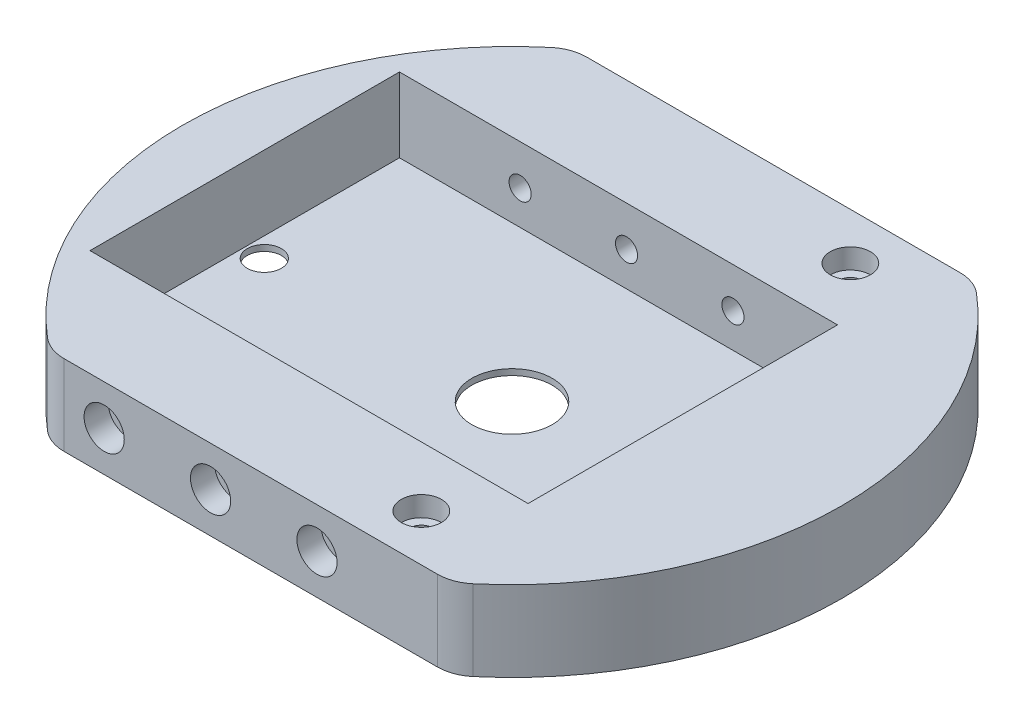
ISO-10303-21;
HEADER;
FILE_DESCRIPTION(('STEP AP214'),'2;1');
FILE_NAME('part.step','',(''),(''),'','','');
FILE_SCHEMA(('AUTOMOTIVE_DESIGN { 1 0 10303 214 1 1 1 1 }'));
ENDSEC;
DATA;
#1=APPLICATION_CONTEXT('core data for automotive mechanical design processes');
#2=APPLICATION_PROTOCOL_DEFINITION('international standard','automotive_design',2000,#1);
#3=PRODUCT_CONTEXT('',#1,'mechanical');
#4=PRODUCT('Part','Part','',(#3));
#5=PRODUCT_RELATED_PRODUCT_CATEGORY('part','',(#4));
#6=PRODUCT_DEFINITION_FORMATION('','',#4);
#7=PRODUCT_DEFINITION_CONTEXT('part definition',#1,'design');
#8=PRODUCT_DEFINITION('design','',#6,#7);
#9=PRODUCT_DEFINITION_SHAPE('','',#8);
#10=(LENGTH_UNIT() NAMED_UNIT(*) SI_UNIT(.MILLI.,.METRE.));
#11=(NAMED_UNIT(*) PLANE_ANGLE_UNIT() SI_UNIT($,.RADIAN.));
#12=(NAMED_UNIT(*) SI_UNIT($,.STERADIAN.) SOLID_ANGLE_UNIT());
#13=UNCERTAINTY_MEASURE_WITH_UNIT(LENGTH_MEASURE(1.E-05),#10,'distance_accuracy_value','');
#14=(GEOMETRIC_REPRESENTATION_CONTEXT(3) GLOBAL_UNCERTAINTY_ASSIGNED_CONTEXT((#13)) GLOBAL_UNIT_ASSIGNED_CONTEXT((#10,
#11,#12)) REPRESENTATION_CONTEXT('',''));
#15=CARTESIAN_POINT('',(0.,0.,0.));
#16=DIRECTION('',(0.,0.,1.));
#17=DIRECTION('',(1.,0.,0.));
#18=AXIS2_PLACEMENT_3D('',#15,#16,#17);
#19=CARTESIAN_POINT('',(30.8149999999999,30.,53.373145635235));
#20=DIRECTION('',(0.,-1.,0.));
#21=DIRECTION('',(0.,0.,-1.));
#22=AXIS2_PLACEMENT_3D('',#19,#20,#21);
#23=CYLINDRICAL_SURFACE('',#22,2.75);
#24=CARTESIAN_POINT('',(30.8149999999999,10.,53.373145635235));
#25=DIRECTION('',(0.,-1.,0.));
#26=DIRECTION('',(0.,0.,-1.));
#27=AXIS2_PLACEMENT_3D('',#24,#25,#26);
#28=CIRCLE('',#27,2.75);
#29=CARTESIAN_POINT('',(30.8149999999999,10.,50.623145635235));
#30=VERTEX_POINT('',#29);
#31=EDGE_CURVE('E280',#30,#30,#28,.T.);
#32=ORIENTED_EDGE('',*,*,#31,.T.);
#33=EDGE_LOOP('',(#32));
#34=FACE_BOUND('',#33,.T.);
#35=CARTESIAN_POINT('',(30.8149999999999,15.,53.373145635235));
#36=DIRECTION('',(0.,1.,0.));
#37=DIRECTION('',(0.,0.,1.));
#38=AXIS2_PLACEMENT_3D('',#35,#36,#37);
#39=CIRCLE('',#38,2.75);
#40=CARTESIAN_POINT('',(30.8149999999999,15.,56.123145635235));
#41=VERTEX_POINT('',#40);
#42=EDGE_CURVE('E37',#41,#41,#39,.F.);
#43=ORIENTED_EDGE('',*,*,#42,.F.);
#44=EDGE_LOOP('',(#43));
#45=FACE_BOUND('',#44,.T.);
#46=ADVANCED_FACE('F33',(#34,#45),#23,.F.);
#47=CARTESIAN_POINT('',(30.8149999999999,30.,-53.373145635235));
#48=DIRECTION('',(0.,-1.,0.));
#49=DIRECTION('',(0.,0.,-1.));
#50=AXIS2_PLACEMENT_3D('',#47,#48,#49);
#51=CYLINDRICAL_SURFACE('',#50,2.75);
#52=CARTESIAN_POINT('',(30.8149999999999,10.,-53.373145635235));
#53=DIRECTION('',(0.,-1.,0.));
#54=DIRECTION('',(0.,0.,-1.));
#55=AXIS2_PLACEMENT_3D('',#52,#53,#54);
#56=CIRCLE('',#55,2.75);
#57=CARTESIAN_POINT('',(30.8149999999999,10.,-56.123145635235));
#58=VERTEX_POINT('',#57);
#59=EDGE_CURVE('E275',#58,#58,#56,.T.);
#60=ORIENTED_EDGE('',*,*,#59,.T.);
#61=EDGE_LOOP('',(#60));
#62=FACE_BOUND('',#61,.T.);
#63=CARTESIAN_POINT('',(30.8149999999999,15.,-53.373145635235));
#64=DIRECTION('',(0.,1.,0.));
#65=DIRECTION('',(0.,0.,1.));
#66=AXIS2_PLACEMENT_3D('',#63,#64,#65);
#67=CIRCLE('',#66,2.75);
#68=CARTESIAN_POINT('',(30.8149999999999,15.,-50.623145635235));
#69=VERTEX_POINT('',#68);
#70=EDGE_CURVE('E273',#69,#69,#67,.F.);
#71=ORIENTED_EDGE('',*,*,#70,.F.);
#72=EDGE_LOOP('',(#71));
#73=FACE_BOUND('',#72,.T.);
#74=ADVANCED_FACE('F386',(#62,#73),#51,.F.);
#75=CARTESIAN_POINT('',(-36.4744881985195,9.99999999999999,-35.));
#76=DIRECTION('',(0.,0.,-1.));
#77=DIRECTION('',(-1.,0.,0.));
#78=AXIS2_PLACEMENT_3D('',#75,#76,#77);
#79=CYLINDRICAL_SURFACE('',#78,2.75);
#80=CARTESIAN_POINT('',(-36.4744881985195,9.99999999999999,-38.5));
#81=DIRECTION('',(0.,0.,-1.));
#82=DIRECTION('',(-1.,0.,0.));
#83=AXIS2_PLACEMENT_3D('',#80,#81,#82);
#84=CIRCLE('',#83,2.75);
#85=CARTESIAN_POINT('',(-39.2244881985195,9.99999999999999,-38.5));
#86=VERTEX_POINT('',#85);
#87=EDGE_CURVE('E242',#86,#86,#84,.T.);
#88=ORIENTED_EDGE('',*,*,#87,.F.);
#89=EDGE_LOOP('',(#88));
#90=FACE_BOUND('',#89,.T.);
#91=CARTESIAN_POINT('',(-36.4744881985195,9.99999999999999,-59.));
#92=DIRECTION('',(0.,0.,-1.));
#93=DIRECTION('',(-1.,0.,0.));
#94=AXIS2_PLACEMENT_3D('',#91,#92,#93);
#95=CIRCLE('',#94,2.75);
#96=CARTESIAN_POINT('',(-39.2244881985195,9.99999999999999,-59.));
#97=VERTEX_POINT('',#96);
#98=EDGE_CURVE('E269',#97,#97,#95,.F.);
#99=ORIENTED_EDGE('',*,*,#98,.F.);
#100=EDGE_LOOP('',(#99));
#101=FACE_BOUND('',#100,.T.);
#102=ADVANCED_FACE('F393',(#90,#101),#79,.F.);
#103=CARTESIAN_POINT('',(-10.0005118014805,10.,-35.));
#104=DIRECTION('',(0.,0.,-1.));
#105=DIRECTION('',(-1.,0.,0.));
#106=AXIS2_PLACEMENT_3D('',#103,#104,#105);
#107=CYLINDRICAL_SURFACE('',#106,2.75);
#108=CARTESIAN_POINT('',(-10.0005118014805,10.,-38.5));
#109=DIRECTION('',(0.,0.,-1.));
#110=DIRECTION('',(-1.,0.,0.));
#111=AXIS2_PLACEMENT_3D('',#108,#109,#110);
#112=CIRCLE('',#111,2.75);
#113=CARTESIAN_POINT('',(-12.7505118014805,10.,-38.5));
#114=VERTEX_POINT('',#113);
#115=EDGE_CURVE('E239',#114,#114,#112,.T.);
#116=ORIENTED_EDGE('',*,*,#115,.F.);
#117=EDGE_LOOP('',(#116));
#118=FACE_BOUND('',#117,.T.);
#119=CARTESIAN_POINT('',(-10.0005118014805,10.,-59.));
#120=DIRECTION('',(0.,0.,-1.));
#121=DIRECTION('',(-1.,0.,0.));
#122=AXIS2_PLACEMENT_3D('',#119,#120,#121);
#123=CIRCLE('',#122,2.75);
#124=CARTESIAN_POINT('',(-12.7505118014805,10.,-59.));
#125=VERTEX_POINT('',#124);
#126=EDGE_CURVE('E264',#125,#125,#123,.F.);
#127=ORIENTED_EDGE('',*,*,#126,.F.);
#128=EDGE_LOOP('',(#127));
#129=FACE_BOUND('',#128,.T.);
#130=ADVANCED_FACE('F450',(#118,#129),#107,.F.);
#131=CARTESIAN_POINT('',(16.4744881985195,9.99999999999999,-35.));
#132=DIRECTION('',(0.,0.,-1.));
#133=DIRECTION('',(-1.,0.,0.));
#134=AXIS2_PLACEMENT_3D('',#131,#132,#133);
#135=CYLINDRICAL_SURFACE('',#134,2.75);
#136=CARTESIAN_POINT('',(16.4744881985195,9.99999999999999,-38.5));
#137=DIRECTION('',(0.,0.,-1.));
#138=DIRECTION('',(-1.,0.,0.));
#139=AXIS2_PLACEMENT_3D('',#136,#137,#138);
#140=CIRCLE('',#139,2.75);
#141=CARTESIAN_POINT('',(13.7244881985195,9.99999999999999,-38.5));
#142=VERTEX_POINT('',#141);
#143=EDGE_CURVE('E236',#142,#142,#140,.T.);
#144=ORIENTED_EDGE('',*,*,#143,.F.);
#145=EDGE_LOOP('',(#144));
#146=FACE_BOUND('',#145,.T.);
#147=CARTESIAN_POINT('',(16.4744881985195,9.99999999999999,-59.));
#148=DIRECTION('',(0.,0.,-1.));
#149=DIRECTION('',(-1.,0.,0.));
#150=AXIS2_PLACEMENT_3D('',#147,#148,#149);
#151=CIRCLE('',#150,2.75);
#152=CARTESIAN_POINT('',(13.7244881985195,9.99999999999999,-59.));
#153=VERTEX_POINT('',#152);
#154=EDGE_CURVE('E259',#153,#153,#151,.F.);
#155=ORIENTED_EDGE('',*,*,#154,.F.);
#156=EDGE_LOOP('',(#155));
#157=FACE_BOUND('',#156,.T.);
#158=ADVANCED_FACE('F454',(#146,#157),#135,.F.);
#159=CARTESIAN_POINT('',(16.4744881985195,10.,35.));
#160=DIRECTION('',(0.,0.,1.));
#161=DIRECTION('',(1.,0.,0.));
#162=AXIS2_PLACEMENT_3D('',#159,#160,#161);
#163=CYLINDRICAL_SURFACE('',#162,2.75);
#164=CARTESIAN_POINT('',(16.4744881985195,10.,38.5));
#165=DIRECTION('',(0.,0.,1.));
#166=DIRECTION('',(1.,0.,0.));
#167=AXIS2_PLACEMENT_3D('',#164,#165,#166);
#168=CIRCLE('',#167,2.75);
#169=CARTESIAN_POINT('',(19.2244881985195,10.,38.5));
#170=VERTEX_POINT('',#169);
#171=EDGE_CURVE('E233',#170,#170,#168,.T.);
#172=ORIENTED_EDGE('',*,*,#171,.F.);
#173=EDGE_LOOP('',(#172));
#174=FACE_BOUND('',#173,.T.);
#175=CARTESIAN_POINT('',(16.4744881985195,10.,59.));
#176=DIRECTION('',(0.,0.,1.));
#177=DIRECTION('',(1.,0.,0.));
#178=AXIS2_PLACEMENT_3D('',#175,#176,#177);
#179=CIRCLE('',#178,2.75);
#180=CARTESIAN_POINT('',(19.2244881985195,10.,59.));
#181=VERTEX_POINT('',#180);
#182=EDGE_CURVE('E254',#181,#181,#179,.F.);
#183=ORIENTED_EDGE('',*,*,#182,.F.);
#184=EDGE_LOOP('',(#183));
#185=FACE_BOUND('',#184,.T.);
#186=ADVANCED_FACE('F458',(#174,#185),#163,.F.);
#187=CARTESIAN_POINT('',(-10.0005118014805,10.,35.));
#188=DIRECTION('',(0.,0.,1.));
#189=DIRECTION('',(1.,0.,0.));
#190=AXIS2_PLACEMENT_3D('',#187,#188,#189);
#191=CYLINDRICAL_SURFACE('',#190,2.75);
#192=CARTESIAN_POINT('',(-10.0005118014805,10.,38.5));
#193=DIRECTION('',(0.,0.,1.));
#194=DIRECTION('',(1.,0.,0.));
#195=AXIS2_PLACEMENT_3D('',#192,#193,#194);
#196=CIRCLE('',#195,2.75);
#197=CARTESIAN_POINT('',(-7.2505118014805,10.,38.5));
#198=VERTEX_POINT('',#197);
#199=EDGE_CURVE('E230',#198,#198,#196,.T.);
#200=ORIENTED_EDGE('',*,*,#199,.F.);
#201=EDGE_LOOP('',(#200));
#202=FACE_BOUND('',#201,.T.);
#203=CARTESIAN_POINT('',(-10.0005118014805,10.,59.));
#204=DIRECTION('',(0.,0.,1.));
#205=DIRECTION('',(1.,0.,0.));
#206=AXIS2_PLACEMENT_3D('',#203,#204,#205);
#207=CIRCLE('',#206,2.75);
#208=CARTESIAN_POINT('',(-7.2505118014805,10.,59.));
#209=VERTEX_POINT('',#208);
#210=EDGE_CURVE('E249',#209,#209,#207,.F.);
#211=ORIENTED_EDGE('',*,*,#210,.F.);
#212=EDGE_LOOP('',(#211));
#213=FACE_BOUND('',#212,.T.);
#214=ADVANCED_FACE('F462',(#202,#213),#191,.F.);
#215=CARTESIAN_POINT('',(-36.4744881985195,10.,35.));
#216=DIRECTION('',(0.,0.,1.));
#217=DIRECTION('',(1.,0.,0.));
#218=AXIS2_PLACEMENT_3D('',#215,#216,#217);
#219=CYLINDRICAL_SURFACE('',#218,2.75);
#220=CARTESIAN_POINT('',(-36.4744881985195,10.,38.5));
#221=DIRECTION('',(0.,0.,1.));
#222=DIRECTION('',(1.,0.,0.));
#223=AXIS2_PLACEMENT_3D('',#220,#221,#222);
#224=CIRCLE('',#223,2.75);
#225=CARTESIAN_POINT('',(-33.7244881985195,10.,38.5));
#226=VERTEX_POINT('',#225);
#227=EDGE_CURVE('E226',#226,#226,#224,.T.);
#228=ORIENTED_EDGE('',*,*,#227,.F.);
#229=EDGE_LOOP('',(#228));
#230=FACE_BOUND('',#229,.T.);
#231=CARTESIAN_POINT('',(-36.4744881985195,10.,59.));
#232=DIRECTION('',(0.,0.,1.));
#233=DIRECTION('',(1.,0.,0.));
#234=AXIS2_PLACEMENT_3D('',#231,#232,#233);
#235=CIRCLE('',#234,2.75);
#236=CARTESIAN_POINT('',(-33.7244881985195,10.,59.));
#237=VERTEX_POINT('',#236);
#238=EDGE_CURVE('E245',#237,#237,#235,.F.);
#239=ORIENTED_EDGE('',*,*,#238,.F.);
#240=EDGE_LOOP('',(#239));
#241=FACE_BOUND('',#240,.T.);
#242=ADVANCED_FACE('F466',(#230,#241),#219,.F.);
#243=CARTESIAN_POINT('',(0.,20.,0.));
#244=DIRECTION('',(0.,-1.,0.));
#245=DIRECTION('',(0.,0.,-1.));
#246=AXIS2_PLACEMENT_3D('',#243,#244,#245);
#247=CYLINDRICAL_SURFACE('',#246,82.0060973342836);
#248=CARTESIAN_POINT('',(0.,20.,0.));
#249=DIRECTION('',(0.,1.,0.));
#250=DIRECTION('',(0.,0.,1.));
#251=AXIS2_PLACEMENT_3D('',#248,#249,#250);
#252=CIRCLE('',#251,82.0060973342836);
#253=CARTESIAN_POINT('',(-52.9287316472048,20.,-62.6382420428462));
#254=VERTEX_POINT('',#253);
#255=CARTESIAN_POINT('',(-52.9287316472048,20.,62.6382420428462));
#256=VERTEX_POINT('',#255);
#257=EDGE_CURVE('E168',#254,#256,#252,.T.);
#258=ORIENTED_EDGE('',*,*,#257,.F.);
#259=DIRECTION('',(0.,-1.,0.));
#260=VECTOR('',#259,1.);
#261=CARTESIAN_POINT('',(-52.9287316472048,20.,-62.6382420428462));
#262=LINE('',#261,#260);
#263=CARTESIAN_POINT('',(-52.9287316472048,0.,-62.6382420428462));
#264=VERTEX_POINT('',#263);
#265=EDGE_CURVE('E191',#254,#264,#262,.T.);
#266=ORIENTED_EDGE('',*,*,#265,.T.);
#267=CARTESIAN_POINT('',(0.,0.,0.));
#268=DIRECTION('',(0.,1.,0.));
#269=DIRECTION('',(0.,0.,1.));
#270=AXIS2_PLACEMENT_3D('',#267,#268,#269);
#271=CIRCLE('',#270,82.0060973342836);
#272=CARTESIAN_POINT('',(-52.9287316472048,0.,62.6382420428462));
#273=VERTEX_POINT('',#272);
#274=EDGE_CURVE('E164',#264,#273,#271,.T.);
#275=ORIENTED_EDGE('',*,*,#274,.T.);
#276=DIRECTION('',(0.,-1.,0.));
#277=VECTOR('',#276,1.);
#278=CARTESIAN_POINT('',(-52.9287316472048,20.,62.6382420428462));
#279=LINE('',#278,#277);
#280=EDGE_CURVE('E180',#273,#256,#279,.F.);
#281=ORIENTED_EDGE('',*,*,#280,.T.);
#282=EDGE_LOOP('',(#258,#266,#275,#281));
#283=FACE_BOUND('',#282,.T.);
#284=ADVANCED_FACE('F352',(#283),#247,.T.);
#285=CARTESIAN_POINT('',(-50.,20.,65.));
#286=DIRECTION('',(0.,0.,-1.));
#287=DIRECTION('',(-1.,0.,0.));
#288=AXIS2_PLACEMENT_3D('',#285,#286,#287);
#289=PLANE('',#288);
#290=CARTESIAN_POINT('',(16.4744881985195,10.,65.));
#291=DIRECTION('',(0.,0.,1.));
#292=DIRECTION('',(1.,0.,0.));
#293=AXIS2_PLACEMENT_3D('',#290,#291,#292);
#294=CIRCLE('',#293,5.);
#295=CARTESIAN_POINT('',(21.4744881985195,10.,65.));
#296=VERTEX_POINT('',#295);
#297=EDGE_CURVE('E262',#296,#296,#294,.T.);
#298=ORIENTED_EDGE('',*,*,#297,.F.);
#299=EDGE_LOOP('',(#298));
#300=FACE_BOUND('',#299,.T.);
#301=CARTESIAN_POINT('',(-10.0005118014805,10.,65.));
#302=DIRECTION('',(0.,0.,1.));
#303=DIRECTION('',(1.,0.,0.));
#304=AXIS2_PLACEMENT_3D('',#301,#302,#303);
#305=CIRCLE('',#304,5.);
#306=CARTESIAN_POINT('',(-5.0005118014805,10.,65.));
#307=VERTEX_POINT('',#306);
#308=EDGE_CURVE('E257',#307,#307,#305,.T.);
#309=ORIENTED_EDGE('',*,*,#308,.F.);
#310=EDGE_LOOP('',(#309));
#311=FACE_BOUND('',#310,.T.);
#312=CARTESIAN_POINT('',(-36.4744881985195,10.,65.));
#313=DIRECTION('',(0.,0.,1.));
#314=DIRECTION('',(1.,0.,0.));
#315=AXIS2_PLACEMENT_3D('',#312,#313,#314);
#316=CIRCLE('',#315,5.);
#317=CARTESIAN_POINT('',(-31.4744881985195,10.,65.));
#318=VERTEX_POINT('',#317);
#319=EDGE_CURVE('E252',#318,#318,#316,.T.);
#320=ORIENTED_EDGE('',*,*,#319,.F.);
#321=EDGE_LOOP('',(#320));
#322=FACE_BOUND('',#321,.T.);
#323=DIRECTION('',(1.,0.,0.));
#324=VECTOR('',#323,1.);
#325=CARTESIAN_POINT('',(-50.,0.,65.));
#326=LINE('',#325,#324);
#327=CARTESIAN_POINT('',(-46.4744881985195,0.,65.));
#328=VERTEX_POINT('',#327);
#329=CARTESIAN_POINT('',(46.4744881985195,0.,65.));
#330=VERTEX_POINT('',#329);
#331=EDGE_CURVE('E183',#328,#330,#326,.T.);
#332=ORIENTED_EDGE('',*,*,#331,.T.);
#333=DIRECTION('',(0.,-1.,0.));
#334=VECTOR('',#333,1.);
#335=CARTESIAN_POINT('',(46.4744881985195,20.,65.));
#336=LINE('',#335,#334);
#337=CARTESIAN_POINT('',(46.4744881985195,20.,65.));
#338=VERTEX_POINT('',#337);
#339=EDGE_CURVE('E11',#330,#338,#336,.F.);
#340=ORIENTED_EDGE('',*,*,#339,.T.);
#341=DIRECTION('',(1.,0.,0.));
#342=VECTOR('',#341,1.);
#343=CARTESIAN_POINT('',(-50.,20.,65.));
#344=LINE('',#343,#342);
#345=CARTESIAN_POINT('',(-46.4744881985195,20.,65.));
#346=VERTEX_POINT('',#345);
#347=EDGE_CURVE('E171',#346,#338,#344,.T.);
#348=ORIENTED_EDGE('',*,*,#347,.F.);
#349=DIRECTION('',(0.,-1.,0.));
#350=VECTOR('',#349,1.);
#351=CARTESIAN_POINT('',(-46.4744881985195,20.,65.));
#352=LINE('',#351,#350);
#353=EDGE_CURVE('E42',#346,#328,#352,.T.);
#354=ORIENTED_EDGE('',*,*,#353,.T.);
#355=EDGE_LOOP('',(#332,#340,#348,#354));
#356=FACE_BOUND('',#355,.T.);
#357=ADVANCED_FACE('F361',(#300,#311,#322,#356),#289,.F.);
#358=CARTESIAN_POINT('',(0.,20.,0.));
#359=DIRECTION('',(0.,-1.,0.));
#360=DIRECTION('',(0.,0.,-1.));
#361=AXIS2_PLACEMENT_3D('',#358,#359,#360);
#362=CYLINDRICAL_SURFACE('',#361,82.0060973342836);
#363=CARTESIAN_POINT('',(0.,0.,0.));
#364=DIRECTION('',(0.,1.,0.));
#365=DIRECTION('',(0.,0.,-1.));
#366=AXIS2_PLACEMENT_3D('',#363,#364,#365);
#367=CIRCLE('',#366,82.0060973342836);
#368=CARTESIAN_POINT('',(52.9287316472048,0.,62.6382420428462));
#369=VERTEX_POINT('',#368);
#370=CARTESIAN_POINT('',(52.9287316472048,0.,-62.6382420428462));
#371=VERTEX_POINT('',#370);
#372=EDGE_CURVE('E186',#369,#371,#367,.T.);
#373=ORIENTED_EDGE('',*,*,#372,.T.);
#374=DIRECTION('',(0.,-1.,0.));
#375=VECTOR('',#374,1.);
#376=CARTESIAN_POINT('',(52.9287316472048,20.,-62.6382420428462));
#377=LINE('',#376,#375);
#378=CARTESIAN_POINT('',(52.9287316472048,20.,-62.6382420428462));
#379=VERTEX_POINT('',#378);
#380=EDGE_CURVE('E58',#371,#379,#377,.F.);
#381=ORIENTED_EDGE('',*,*,#380,.T.);
#382=CARTESIAN_POINT('',(0.,20.,0.));
#383=DIRECTION('',(0.,1.,0.));
#384=DIRECTION('',(0.,0.,-1.));
#385=AXIS2_PLACEMENT_3D('',#382,#383,#384);
#386=CIRCLE('',#385,82.0060973342836);
#387=CARTESIAN_POINT('',(52.9287316472048,20.,62.6382420428462));
#388=VERTEX_POINT('',#387);
#389=EDGE_CURVE('E175',#388,#379,#386,.T.);
#390=ORIENTED_EDGE('',*,*,#389,.F.);
#391=DIRECTION('',(0.,-1.,0.));
#392=VECTOR('',#391,1.);
#393=CARTESIAN_POINT('',(52.9287316472048,20.,62.6382420428462));
#394=LINE('',#393,#392);
#395=EDGE_CURVE('E215',#388,#369,#394,.T.);
#396=ORIENTED_EDGE('',*,*,#395,.T.);
#397=EDGE_LOOP('',(#373,#381,#390,#396));
#398=FACE_BOUND('',#397,.T.);
#399=ADVANCED_FACE('F367',(#398),#362,.T.);
#400=CARTESIAN_POINT('',(50.,20.,-65.));
#401=DIRECTION('',(0.,0.,1.));
#402=DIRECTION('',(1.,0.,0.));
#403=AXIS2_PLACEMENT_3D('',#400,#401,#402);
#404=PLANE('',#403);
#405=CARTESIAN_POINT('',(-36.4744881985195,9.99999999999999,-65.));
#406=DIRECTION('',(0.,0.,-1.));
#407=DIRECTION('',(-1.,0.,0.));
#408=AXIS2_PLACEMENT_3D('',#405,#406,#407);
#409=CIRCLE('',#408,5.);
#410=CARTESIAN_POINT('',(-41.4744881985195,9.99999999999999,-65.));
#411=VERTEX_POINT('',#410);
#412=EDGE_CURVE('E295',#411,#411,#409,.T.);
#413=ORIENTED_EDGE('',*,*,#412,.F.);
#414=EDGE_LOOP('',(#413));
#415=FACE_BOUND('',#414,.T.);
#416=CARTESIAN_POINT('',(-10.0005118014805,10.,-65.));
#417=DIRECTION('',(0.,0.,-1.));
#418=DIRECTION('',(-1.,0.,0.));
#419=AXIS2_PLACEMENT_3D('',#416,#417,#418);
#420=CIRCLE('',#419,5.);
#421=CARTESIAN_POINT('',(-15.0005118014805,10.,-65.));
#422=VERTEX_POINT('',#421);
#423=EDGE_CURVE('E271',#422,#422,#420,.T.);
#424=ORIENTED_EDGE('',*,*,#423,.F.);
#425=EDGE_LOOP('',(#424));
#426=FACE_BOUND('',#425,.T.);
#427=CARTESIAN_POINT('',(16.4744881985195,9.99999999999999,-65.));
#428=DIRECTION('',(0.,0.,-1.));
#429=DIRECTION('',(-1.,0.,0.));
#430=AXIS2_PLACEMENT_3D('',#427,#428,#429);
#431=CIRCLE('',#430,5.);
#432=CARTESIAN_POINT('',(11.4744881985195,9.99999999999999,-65.));
#433=VERTEX_POINT('',#432);
#434=EDGE_CURVE('E267',#433,#433,#431,.T.);
#435=ORIENTED_EDGE('',*,*,#434,.F.);
#436=EDGE_LOOP('',(#435));
#437=FACE_BOUND('',#436,.T.);
#438=DIRECTION('',(-1.,0.,0.));
#439=VECTOR('',#438,1.);
#440=CARTESIAN_POINT('',(50.,0.,-65.));
#441=LINE('',#440,#439);
#442=CARTESIAN_POINT('',(46.4744881985195,0.,-65.));
#443=VERTEX_POINT('',#442);
#444=CARTESIAN_POINT('',(-46.4744881985195,0.,-65.));
#445=VERTEX_POINT('',#444);
#446=EDGE_CURVE('E172',#443,#445,#441,.T.);
#447=ORIENTED_EDGE('',*,*,#446,.T.);
#448=DIRECTION('',(0.,-1.,0.));
#449=VECTOR('',#448,1.);
#450=CARTESIAN_POINT('',(-46.4744881985195,20.,-65.));
#451=LINE('',#450,#449);
#452=CARTESIAN_POINT('',(-46.4744881985195,20.,-65.));
#453=VERTEX_POINT('',#452);
#454=EDGE_CURVE('E205',#445,#453,#451,.F.);
#455=ORIENTED_EDGE('',*,*,#454,.T.);
#456=DIRECTION('',(-1.,0.,0.));
#457=VECTOR('',#456,1.);
#458=CARTESIAN_POINT('',(50.,20.,-65.));
#459=LINE('',#458,#457);
#460=CARTESIAN_POINT('',(46.4744881985195,20.,-65.));
#461=VERTEX_POINT('',#460);
#462=EDGE_CURVE('E177',#461,#453,#459,.T.);
#463=ORIENTED_EDGE('',*,*,#462,.F.);
#464=DIRECTION('',(0.,-1.,0.));
#465=VECTOR('',#464,1.);
#466=CARTESIAN_POINT('',(46.4744881985195,20.,-65.));
#467=LINE('',#466,#465);
#468=EDGE_CURVE('E202',#461,#443,#467,.T.);
#469=ORIENTED_EDGE('',*,*,#468,.T.);
#470=EDGE_LOOP('',(#447,#455,#463,#469));
#471=FACE_BOUND('',#470,.T.);
#472=ADVANCED_FACE('F374',(#415,#426,#437,#471),#404,.F.);
#473=CARTESIAN_POINT('',(0.,20.,0.));
#474=DIRECTION('',(0.,1.,0.));
#475=DIRECTION('',(0.,0.,1.));
#476=AXIS2_PLACEMENT_3D('',#473,#474,#475);
#477=PLANE('',#476);
#478=CARTESIAN_POINT('',(30.8149999999999,20.,53.373145635235));
#479=DIRECTION('',(0.,1.,0.));
#480=DIRECTION('',(0.,0.,1.));
#481=AXIS2_PLACEMENT_3D('',#478,#479,#480);
#482=CIRCLE('',#481,5.);
#483=CARTESIAN_POINT('',(30.8149999999999,20.,58.373145635235));
#484=VERTEX_POINT('',#483);
#485=EDGE_CURVE('E290',#484,#484,#482,.T.);
#486=ORIENTED_EDGE('',*,*,#485,.F.);
#487=EDGE_LOOP('',(#486));
#488=FACE_BOUND('',#487,.T.);
#489=CARTESIAN_POINT('',(30.8149999999999,20.,-53.373145635235));
#490=DIRECTION('',(0.,1.,0.));
#491=DIRECTION('',(0.,0.,1.));
#492=AXIS2_PLACEMENT_3D('',#489,#490,#491);
#493=CIRCLE('',#492,5.);
#494=CARTESIAN_POINT('',(30.8149999999999,20.,-48.373145635235));
#495=VERTEX_POINT('',#494);
#496=EDGE_CURVE('E283',#495,#495,#493,.T.);
#497=ORIENTED_EDGE('',*,*,#496,.F.);
#498=EDGE_LOOP('',(#497));
#499=FACE_BOUND('',#498,.T.);
#500=DIRECTION('',(0.,0.,-1.));
#501=VECTOR('',#500,1.);
#502=CARTESIAN_POINT('',(42.5,20.,38.5));
#503=LINE('',#502,#501);
#504=CARTESIAN_POINT('',(42.5,20.,38.5));
#505=VERTEX_POINT('',#504);
#506=CARTESIAN_POINT('',(42.5,20.,-38.5));
#507=VERTEX_POINT('',#506);
#508=EDGE_CURVE('E50',#505,#507,#503,.T.);
#509=ORIENTED_EDGE('',*,*,#508,.F.);
#510=DIRECTION('',(1.,0.,0.));
#511=VECTOR('',#510,1.);
#512=CARTESIAN_POINT('',(-66.5,20.,38.5));
#513=LINE('',#512,#511);
#514=CARTESIAN_POINT('',(-66.5,20.,38.5));
#515=VERTEX_POINT('',#514);
#516=EDGE_CURVE('E145',#515,#505,#513,.T.);
#517=ORIENTED_EDGE('',*,*,#516,.F.);
#518=DIRECTION('',(0.,0.,1.));
#519=VECTOR('',#518,1.);
#520=CARTESIAN_POINT('',(-66.5,20.,38.5));
#521=LINE('',#520,#519);
#522=CARTESIAN_POINT('',(-66.5,20.,-38.5));
#523=VERTEX_POINT('',#522);
#524=EDGE_CURVE('E148',#523,#515,#521,.T.);
#525=ORIENTED_EDGE('',*,*,#524,.F.);
#526=DIRECTION('',(-1.,0.,0.));
#527=VECTOR('',#526,1.);
#528=CARTESIAN_POINT('',(-66.5,20.,-38.5));
#529=LINE('',#528,#527);
#530=EDGE_CURVE('E157',#507,#523,#529,.T.);
#531=ORIENTED_EDGE('',*,*,#530,.F.);
#532=EDGE_LOOP('',(#509,#517,#525,#531));
#533=FACE_BOUND('',#532,.T.);
#534=ORIENTED_EDGE('',*,*,#462,.T.);
#535=CARTESIAN_POINT('',(-46.4744881985195,20.,-55.));
#536=DIRECTION('',(0.,1.,0.));
#537=DIRECTION('',(0.,0.,1.));
#538=AXIS2_PLACEMENT_3D('',#535,#536,#537);
#539=CIRCLE('',#538,10.);
#540=EDGE_CURVE('E213',#453,#254,#539,.T.);
#541=ORIENTED_EDGE('',*,*,#540,.T.);
#542=ORIENTED_EDGE('',*,*,#257,.T.);
#543=CARTESIAN_POINT('',(-46.4744881985195,20.,55.));
#544=DIRECTION('',(0.,1.,0.));
#545=DIRECTION('',(0.,0.,1.));
#546=AXIS2_PLACEMENT_3D('',#543,#544,#545);
#547=CIRCLE('',#546,10.);
#548=EDGE_CURVE('E207',#256,#346,#547,.T.);
#549=ORIENTED_EDGE('',*,*,#548,.T.);
#550=ORIENTED_EDGE('',*,*,#347,.T.);
#551=CARTESIAN_POINT('',(46.4744881985195,20.,55.));
#552=DIRECTION('',(0.,1.,0.));
#553=DIRECTION('',(0.,0.,1.));
#554=AXIS2_PLACEMENT_3D('',#551,#552,#553);
#555=CIRCLE('',#554,10.);
#556=EDGE_CURVE('E209',#338,#388,#555,.T.);
#557=ORIENTED_EDGE('',*,*,#556,.T.);
#558=ORIENTED_EDGE('',*,*,#389,.T.);
#559=CARTESIAN_POINT('',(46.4744881985195,20.,-55.));
#560=DIRECTION('',(0.,1.,0.));
#561=DIRECTION('',(0.,0.,1.));
#562=AXIS2_PLACEMENT_3D('',#559,#560,#561);
#563=CIRCLE('',#562,10.);
#564=EDGE_CURVE('E211',#379,#461,#563,.T.);
#565=ORIENTED_EDGE('',*,*,#564,.T.);
#566=EDGE_LOOP('',(#534,#541,#542,#549,#550,#557,#558,#565));
#567=FACE_BOUND('',#566,.T.);
#568=ADVANCED_FACE('F343',(#488,#499,#533,#567),#477,.T.);
#569=CARTESIAN_POINT('',(0.,0.,0.));
#570=DIRECTION('',(0.,1.,0.));
#571=DIRECTION('',(0.,0.,1.));
#572=AXIS2_PLACEMENT_3D('',#569,#570,#571);
#573=PLANE('',#572);
#574=CARTESIAN_POINT('',(0.,0.,0.));
#575=DIRECTION('',(0.,1.,0.));
#576=DIRECTION('',(0.,0.,1.));
#577=AXIS2_PLACEMENT_3D('',#574,#575,#576);
#578=CIRCLE('',#577,10.);
#579=CARTESIAN_POINT('',(0.,0.,10.));
#580=VERTEX_POINT('',#579);
#581=EDGE_CURVE('E322',#580,#580,#578,.T.);
#582=ORIENTED_EDGE('',*,*,#581,.T.);
#583=EDGE_LOOP('',(#582));
#584=FACE_BOUND('',#583,.T.);
#585=CARTESIAN_POINT('',(-61.63,0.,0.));
#586=DIRECTION('',(0.,-1.,0.));
#587=DIRECTION('',(0.,0.,-1.));
#588=AXIS2_PLACEMENT_3D('',#585,#586,#587);
#589=CIRCLE('',#588,4.25000000000001);
#590=CARTESIAN_POINT('',(-61.63,0.,-4.25000000000001));
#591=VERTEX_POINT('',#590);
#592=EDGE_CURVE('E225',#591,#591,#589,.T.);
#593=ORIENTED_EDGE('',*,*,#592,.F.);
#594=EDGE_LOOP('',(#593));
#595=FACE_BOUND('',#594,.T.);
#596=CARTESIAN_POINT('',(30.8149999999999,0.,-53.373145635235));
#597=DIRECTION('',(0.,-1.,0.));
#598=DIRECTION('',(0.,0.,-1.));
#599=AXIS2_PLACEMENT_3D('',#596,#597,#598);
#600=CIRCLE('',#599,8.25);
#601=CARTESIAN_POINT('',(30.8149999999999,0.,-61.623145635235));
#602=VERTEX_POINT('',#601);
#603=EDGE_CURVE('E224',#602,#602,#600,.T.);
#604=ORIENTED_EDGE('',*,*,#603,.F.);
#605=EDGE_LOOP('',(#604));
#606=FACE_BOUND('',#605,.T.);
#607=CARTESIAN_POINT('',(30.8149999999999,0.,53.373145635235));
#608=DIRECTION('',(0.,-1.,0.));
#609=DIRECTION('',(0.,0.,-1.));
#610=AXIS2_PLACEMENT_3D('',#607,#608,#609);
#611=CIRCLE('',#610,8.25);
#612=CARTESIAN_POINT('',(30.8149999999999,0.,45.123145635235));
#613=VERTEX_POINT('',#612);
#614=EDGE_CURVE('E151',#613,#613,#611,.T.);
#615=ORIENTED_EDGE('',*,*,#614,.F.);
#616=EDGE_LOOP('',(#615));
#617=FACE_BOUND('',#616,.T.);
#618=ORIENTED_EDGE('',*,*,#274,.F.);
#619=CARTESIAN_POINT('',(-46.4744881985195,0.,-55.));
#620=DIRECTION('',(0.,1.,0.));
#621=DIRECTION('',(0.,0.,1.));
#622=AXIS2_PLACEMENT_3D('',#619,#620,#621);
#623=CIRCLE('',#622,10.);
#624=EDGE_CURVE('E200',#264,#445,#623,.F.);
#625=ORIENTED_EDGE('',*,*,#624,.T.);
#626=ORIENTED_EDGE('',*,*,#446,.F.);
#627=CARTESIAN_POINT('',(46.4744881985195,0.,-55.));
#628=DIRECTION('',(0.,1.,0.));
#629=DIRECTION('',(0.,0.,1.));
#630=AXIS2_PLACEMENT_3D('',#627,#628,#629);
#631=CIRCLE('',#630,10.);
#632=EDGE_CURVE('E198',#443,#371,#631,.F.);
#633=ORIENTED_EDGE('',*,*,#632,.T.);
#634=ORIENTED_EDGE('',*,*,#372,.F.);
#635=CARTESIAN_POINT('',(46.4744881985195,0.,55.));
#636=DIRECTION('',(0.,1.,0.));
#637=DIRECTION('',(0.,0.,1.));
#638=AXIS2_PLACEMENT_3D('',#635,#636,#637);
#639=CIRCLE('',#638,10.);
#640=EDGE_CURVE('E196',#369,#330,#639,.F.);
#641=ORIENTED_EDGE('',*,*,#640,.T.);
#642=ORIENTED_EDGE('',*,*,#331,.F.);
#643=CARTESIAN_POINT('',(-46.4744881985195,0.,55.));
#644=DIRECTION('',(0.,1.,0.));
#645=DIRECTION('',(0.,0.,1.));
#646=AXIS2_PLACEMENT_3D('',#643,#644,#645);
#647=CIRCLE('',#646,10.);
#648=EDGE_CURVE('E194',#328,#273,#647,.F.);
#649=ORIENTED_EDGE('',*,*,#648,.T.);
#650=EDGE_LOOP('',(#618,#625,#626,#633,#634,#641,#642,#649));
#651=FACE_BOUND('',#650,.T.);
#652=ADVANCED_FACE('F339',(#584,#595,#606,#617,#651),#573,.F.);
#653=CARTESIAN_POINT('',(-46.4744881985195,20.,-55.));
#654=DIRECTION('',(0.,-1.,0.));
#655=DIRECTION('',(0.,0.,-1.));
#656=AXIS2_PLACEMENT_3D('',#653,#654,#655);
#657=CYLINDRICAL_SURFACE('',#656,10.);
#658=ORIENTED_EDGE('',*,*,#540,.F.);
#659=ORIENTED_EDGE('',*,*,#454,.F.);
#660=ORIENTED_EDGE('',*,*,#624,.F.);
#661=ORIENTED_EDGE('',*,*,#265,.F.);
#662=EDGE_LOOP('',(#658,#659,#660,#661));
#663=FACE_BOUND('',#662,.T.);
#664=ADVANCED_FACE('F342',(#663),#657,.T.);
#665=CARTESIAN_POINT('',(46.4744881985195,20.,-55.));
#666=DIRECTION('',(0.,-1.,0.));
#667=DIRECTION('',(0.,0.,-1.));
#668=AXIS2_PLACEMENT_3D('',#665,#666,#667);
#669=CYLINDRICAL_SURFACE('',#668,10.);
#670=ORIENTED_EDGE('',*,*,#564,.F.);
#671=ORIENTED_EDGE('',*,*,#380,.F.);
#672=ORIENTED_EDGE('',*,*,#632,.F.);
#673=ORIENTED_EDGE('',*,*,#468,.F.);
#674=EDGE_LOOP('',(#670,#671,#672,#673));
#675=FACE_BOUND('',#674,.T.);
#676=ADVANCED_FACE('F371',(#675),#669,.T.);
#677=CARTESIAN_POINT('',(46.4744881985195,20.,55.));
#678=DIRECTION('',(0.,-1.,0.));
#679=DIRECTION('',(0.,0.,-1.));
#680=AXIS2_PLACEMENT_3D('',#677,#678,#679);
#681=CYLINDRICAL_SURFACE('',#680,10.);
#682=ORIENTED_EDGE('',*,*,#556,.F.);
#683=ORIENTED_EDGE('',*,*,#339,.F.);
#684=ORIENTED_EDGE('',*,*,#640,.F.);
#685=ORIENTED_EDGE('',*,*,#395,.F.);
#686=EDGE_LOOP('',(#682,#683,#684,#685));
#687=FACE_BOUND('',#686,.T.);
#688=ADVANCED_FACE('F364',(#687),#681,.T.);
#689=CARTESIAN_POINT('',(-46.4744881985195,20.,55.));
#690=DIRECTION('',(0.,-1.,0.));
#691=DIRECTION('',(0.,0.,-1.));
#692=AXIS2_PLACEMENT_3D('',#689,#690,#691);
#693=CYLINDRICAL_SURFACE('',#692,10.);
#694=ORIENTED_EDGE('',*,*,#548,.F.);
#695=ORIENTED_EDGE('',*,*,#280,.F.);
#696=ORIENTED_EDGE('',*,*,#648,.F.);
#697=ORIENTED_EDGE('',*,*,#353,.F.);
#698=EDGE_LOOP('',(#694,#695,#696,#697));
#699=FACE_BOUND('',#698,.T.);
#700=ADVANCED_FACE('F35',(#699),#693,.T.);
#701=CARTESIAN_POINT('',(42.5,1.5,38.5));
#702=DIRECTION('',(1.,0.,0.));
#703=DIRECTION('',(0.,0.,-1.));
#704=AXIS2_PLACEMENT_3D('',#701,#702,#703);
#705=PLANE('',#704);
#706=ORIENTED_EDGE('',*,*,#508,.T.);
#707=DIRECTION('',(0.,1.,0.));
#708=VECTOR('',#707,1.);
#709=CARTESIAN_POINT('',(42.5,1.5,-38.5));
#710=LINE('',#709,#708);
#711=CARTESIAN_POINT('',(42.5,1.5,-38.5));
#712=VERTEX_POINT('',#711);
#713=EDGE_CURVE('E123',#712,#507,#710,.T.);
#714=ORIENTED_EDGE('',*,*,#713,.F.);
#715=DIRECTION('',(0.,0.,-1.));
#716=VECTOR('',#715,1.);
#717=CARTESIAN_POINT('',(42.5,1.5,38.5));
#718=LINE('',#717,#716);
#719=CARTESIAN_POINT('',(42.5,1.5,38.5));
#720=VERTEX_POINT('',#719);
#721=EDGE_CURVE('E127',#720,#712,#718,.T.);
#722=ORIENTED_EDGE('',*,*,#721,.F.);
#723=DIRECTION('',(0.,1.,0.));
#724=VECTOR('',#723,1.);
#725=CARTESIAN_POINT('',(42.5,1.5,38.5));
#726=LINE('',#725,#724);
#727=EDGE_CURVE('E162',#720,#505,#726,.T.);
#728=ORIENTED_EDGE('',*,*,#727,.T.);
#729=EDGE_LOOP('',(#706,#714,#722,#728));
#730=FACE_BOUND('',#729,.T.);
#731=ADVANCED_FACE('F125',(#730),#705,.F.);
#732=CARTESIAN_POINT('',(-66.5,1.5,38.5));
#733=DIRECTION('',(0.,0.,1.));
#734=DIRECTION('',(1.,0.,0.));
#735=AXIS2_PLACEMENT_3D('',#732,#733,#734);
#736=PLANE('',#735);
#737=ORIENTED_EDGE('',*,*,#171,.T.);
#738=EDGE_LOOP('',(#737));
#739=FACE_BOUND('',#738,.T.);
#740=ORIENTED_EDGE('',*,*,#199,.T.);
#741=EDGE_LOOP('',(#740));
#742=FACE_BOUND('',#741,.T.);
#743=ORIENTED_EDGE('',*,*,#227,.T.);
#744=EDGE_LOOP('',(#743));
#745=FACE_BOUND('',#744,.T.);
#746=ORIENTED_EDGE('',*,*,#516,.T.);
#747=ORIENTED_EDGE('',*,*,#727,.F.);
#748=DIRECTION('',(1.,0.,0.));
#749=VECTOR('',#748,1.);
#750=CARTESIAN_POINT('',(-66.5,1.5,38.5));
#751=LINE('',#750,#749);
#752=CARTESIAN_POINT('',(-66.5,1.5,38.5));
#753=VERTEX_POINT('',#752);
#754=EDGE_CURVE('E133',#753,#720,#751,.T.);
#755=ORIENTED_EDGE('',*,*,#754,.F.);
#756=DIRECTION('',(0.,1.,0.));
#757=VECTOR('',#756,1.);
#758=CARTESIAN_POINT('',(-66.5,1.5,38.5));
#759=LINE('',#758,#757);
#760=EDGE_CURVE('E165',#753,#515,#759,.T.);
#761=ORIENTED_EDGE('',*,*,#760,.T.);
#762=EDGE_LOOP('',(#746,#747,#755,#761));
#763=FACE_BOUND('',#762,.T.);
#764=ADVANCED_FACE('F496',(#739,#742,#745,#763),#736,.F.);
#765=CARTESIAN_POINT('',(-66.5,1.5,38.5));
#766=DIRECTION('',(-1.,0.,0.));
#767=DIRECTION('',(0.,0.,1.));
#768=AXIS2_PLACEMENT_3D('',#765,#766,#767);
#769=PLANE('',#768);
#770=ORIENTED_EDGE('',*,*,#524,.T.);
#771=ORIENTED_EDGE('',*,*,#760,.F.);
#772=DIRECTION('',(0.,0.,1.));
#773=VECTOR('',#772,1.);
#774=CARTESIAN_POINT('',(-66.5,1.5,38.5));
#775=LINE('',#774,#773);
#776=CARTESIAN_POINT('',(-66.5,1.5,-38.5));
#777=VERTEX_POINT('',#776);
#778=EDGE_CURVE('E141',#777,#753,#775,.T.);
#779=ORIENTED_EDGE('',*,*,#778,.F.);
#780=DIRECTION('',(0.,1.,0.));
#781=VECTOR('',#780,1.);
#782=CARTESIAN_POINT('',(-66.5,1.5,-38.5));
#783=LINE('',#782,#781);
#784=EDGE_CURVE('E132',#777,#523,#783,.T.);
#785=ORIENTED_EDGE('',*,*,#784,.T.);
#786=EDGE_LOOP('',(#770,#771,#779,#785));
#787=FACE_BOUND('',#786,.T.);
#788=ADVANCED_FACE('F499',(#787),#769,.F.);
#789=CARTESIAN_POINT('',(-66.5,1.5,-38.5));
#790=DIRECTION('',(0.,0.,-1.));
#791=DIRECTION('',(-1.,0.,0.));
#792=AXIS2_PLACEMENT_3D('',#789,#790,#791);
#793=PLANE('',#792);
#794=ORIENTED_EDGE('',*,*,#87,.T.);
#795=EDGE_LOOP('',(#794));
#796=FACE_BOUND('',#795,.T.);
#797=ORIENTED_EDGE('',*,*,#115,.T.);
#798=EDGE_LOOP('',(#797));
#799=FACE_BOUND('',#798,.T.);
#800=ORIENTED_EDGE('',*,*,#143,.T.);
#801=EDGE_LOOP('',(#800));
#802=FACE_BOUND('',#801,.T.);
#803=ORIENTED_EDGE('',*,*,#530,.T.);
#804=ORIENTED_EDGE('',*,*,#784,.F.);
#805=DIRECTION('',(-1.,0.,0.));
#806=VECTOR('',#805,1.);
#807=CARTESIAN_POINT('',(-66.5,1.5,-38.5));
#808=LINE('',#807,#806);
#809=EDGE_CURVE('E136',#712,#777,#808,.T.);
#810=ORIENTED_EDGE('',*,*,#809,.F.);
#811=ORIENTED_EDGE('',*,*,#713,.T.);
#812=EDGE_LOOP('',(#803,#804,#810,#811));
#813=FACE_BOUND('',#812,.T.);
#814=ADVANCED_FACE('F137',(#796,#799,#802,#813),#793,.F.);
#815=CARTESIAN_POINT('',(0.,1.5,0.));
#816=DIRECTION('',(0.,-1.,0.));
#817=DIRECTION('',(0.,0.,-1.));
#818=AXIS2_PLACEMENT_3D('',#815,#816,#817);
#819=PLANE('',#818);
#820=CARTESIAN_POINT('',(0.,1.5,0.));
#821=DIRECTION('',(0.,1.,0.));
#822=DIRECTION('',(0.,0.,1.));
#823=AXIS2_PLACEMENT_3D('',#820,#821,#822);
#824=CIRCLE('',#823,10.);
#825=CARTESIAN_POINT('',(0.,1.5,10.));
#826=VERTEX_POINT('',#825);
#827=EDGE_CURVE('E229',#826,#826,#824,.T.);
#828=ORIENTED_EDGE('',*,*,#827,.F.);
#829=EDGE_LOOP('',(#828));
#830=FACE_BOUND('',#829,.T.);
#831=CARTESIAN_POINT('',(-61.63,1.5,0.));
#832=DIRECTION('',(0.,-1.,0.));
#833=DIRECTION('',(0.,0.,-1.));
#834=AXIS2_PLACEMENT_3D('',#831,#832,#833);
#835=CIRCLE('',#834,4.25000000000001);
#836=CARTESIAN_POINT('',(-61.63,1.5,-4.25000000000001));
#837=VERTEX_POINT('',#836);
#838=EDGE_CURVE('E221',#837,#837,#835,.T.);
#839=ORIENTED_EDGE('',*,*,#838,.T.);
#840=EDGE_LOOP('',(#839));
#841=FACE_BOUND('',#840,.T.);
#842=ORIENTED_EDGE('',*,*,#721,.T.);
#843=ORIENTED_EDGE('',*,*,#809,.T.);
#844=ORIENTED_EDGE('',*,*,#778,.T.);
#845=ORIENTED_EDGE('',*,*,#754,.T.);
#846=EDGE_LOOP('',(#842,#843,#844,#845));
#847=FACE_BOUND('',#846,.T.);
#848=ADVANCED_FACE('F143',(#830,#841,#847),#819,.F.);
#849=CARTESIAN_POINT('',(30.8149999999999,10.,53.373145635235));
#850=DIRECTION('',(0.,-1.,0.));
#851=DIRECTION('',(0.,0.,-1.));
#852=AXIS2_PLACEMENT_3D('',#849,#850,#851);
#853=CYLINDRICAL_SURFACE('',#852,8.25);
#854=CARTESIAN_POINT('',(30.8149999999999,10.,53.373145635235));
#855=DIRECTION('',(0.,-1.,0.));
#856=DIRECTION('',(0.,0.,-1.));
#857=AXIS2_PLACEMENT_3D('',#854,#855,#856);
#858=CIRCLE('',#857,8.25);
#859=CARTESIAN_POINT('',(30.8149999999999,10.,45.123145635235));
#860=VERTEX_POINT('',#859);
#861=EDGE_CURVE('E158',#860,#860,#858,.T.);
#862=ORIENTED_EDGE('',*,*,#861,.F.);
#863=EDGE_LOOP('',(#862));
#864=FACE_BOUND('',#863,.T.);
#865=ORIENTED_EDGE('',*,*,#614,.T.);
#866=EDGE_LOOP('',(#865));
#867=FACE_BOUND('',#866,.T.);
#868=ADVANCED_FACE('F337',(#864,#867),#853,.F.);
#869=CARTESIAN_POINT('',(30.8149999999999,10.,53.373145635235));
#870=DIRECTION('',(0.,-1.,0.));
#871=DIRECTION('',(0.,0.,-1.));
#872=AXIS2_PLACEMENT_3D('',#869,#870,#871);
#873=PLANE('',#872);
#874=ORIENTED_EDGE('',*,*,#31,.F.);
#875=EDGE_LOOP('',(#874));
#876=FACE_BOUND('',#875,.T.);
#877=ORIENTED_EDGE('',*,*,#861,.T.);
#878=EDGE_LOOP('',(#877));
#879=FACE_BOUND('',#878,.T.);
#880=ADVANCED_FACE('F485',(#876,#879),#873,.T.);
#881=CARTESIAN_POINT('',(30.8149999999999,10.,-53.373145635235));
#882=DIRECTION('',(0.,-1.,0.));
#883=DIRECTION('',(0.,0.,-1.));
#884=AXIS2_PLACEMENT_3D('',#881,#882,#883);
#885=CYLINDRICAL_SURFACE('',#884,8.25);
#886=CARTESIAN_POINT('',(30.8149999999999,10.,-53.373145635235));
#887=DIRECTION('',(0.,-1.,0.));
#888=DIRECTION('',(0.,0.,-1.));
#889=AXIS2_PLACEMENT_3D('',#886,#887,#888);
#890=CIRCLE('',#889,8.25);
#891=CARTESIAN_POINT('',(30.8149999999999,10.,-61.623145635235));
#892=VERTEX_POINT('',#891);
#893=EDGE_CURVE('E327',#892,#892,#890,.T.);
#894=ORIENTED_EDGE('',*,*,#893,.F.);
#895=EDGE_LOOP('',(#894));
#896=FACE_BOUND('',#895,.T.);
#897=ORIENTED_EDGE('',*,*,#603,.T.);
#898=EDGE_LOOP('',(#897));
#899=FACE_BOUND('',#898,.T.);
#900=ADVANCED_FACE('F481',(#896,#899),#885,.F.);
#901=CARTESIAN_POINT('',(30.8149999999999,10.,-53.373145635235));
#902=DIRECTION('',(0.,-1.,0.));
#903=DIRECTION('',(0.,0.,-1.));
#904=AXIS2_PLACEMENT_3D('',#901,#902,#903);
#905=PLANE('',#904);
#906=ORIENTED_EDGE('',*,*,#59,.F.);
#907=EDGE_LOOP('',(#906));
#908=FACE_BOUND('',#907,.T.);
#909=ORIENTED_EDGE('',*,*,#893,.T.);
#910=EDGE_LOOP('',(#909));
#911=FACE_BOUND('',#910,.T.);
#912=ADVANCED_FACE('F477',(#908,#911),#905,.T.);
#913=CARTESIAN_POINT('',(-61.63,10.,0.));
#914=DIRECTION('',(0.,-1.,0.));
#915=DIRECTION('',(0.,0.,-1.));
#916=AXIS2_PLACEMENT_3D('',#913,#914,#915);
#917=CYLINDRICAL_SURFACE('',#916,4.25000000000001);
#918=ORIENTED_EDGE('',*,*,#592,.T.);
#919=EDGE_LOOP('',(#918));
#920=FACE_BOUND('',#919,.T.);
#921=ORIENTED_EDGE('',*,*,#838,.F.);
#922=EDGE_LOOP('',(#921));
#923=FACE_BOUND('',#922,.T.);
#924=ADVANCED_FACE('F473',(#920,#923),#917,.F.);
#925=CARTESIAN_POINT('',(0.,-8.5,0.));
#926=DIRECTION('',(0.,1.,0.));
#927=DIRECTION('',(0.,0.,1.));
#928=AXIS2_PLACEMENT_3D('',#925,#926,#927);
#929=CYLINDRICAL_SURFACE('',#928,10.);
#930=ORIENTED_EDGE('',*,*,#827,.T.);
#931=EDGE_LOOP('',(#930));
#932=FACE_BOUND('',#931,.T.);
#933=ORIENTED_EDGE('',*,*,#581,.F.);
#934=EDGE_LOOP('',(#933));
#935=FACE_BOUND('',#934,.T.);
#936=ADVANCED_FACE('F443',(#932,#935),#929,.F.);
#937=CARTESIAN_POINT('',(-36.4744881985195,10.,59.));
#938=DIRECTION('',(0.,0.,1.));
#939=DIRECTION('',(1.,0.,0.));
#940=AXIS2_PLACEMENT_3D('',#937,#938,#939);
#941=PLANE('',#940);
#942=CARTESIAN_POINT('',(-36.4744881985195,10.,59.));
#943=DIRECTION('',(0.,0.,1.));
#944=DIRECTION('',(1.,0.,0.));
#945=AXIS2_PLACEMENT_3D('',#942,#943,#944);
#946=CIRCLE('',#945,5.);
#947=CARTESIAN_POINT('',(-31.4744881985195,10.,59.));
#948=VERTEX_POINT('',#947);
#949=EDGE_CURVE('E248',#948,#948,#946,.T.);
#950=ORIENTED_EDGE('',*,*,#949,.T.);
#951=EDGE_LOOP('',(#950));
#952=FACE_BOUND('',#951,.T.);
#953=ORIENTED_EDGE('',*,*,#238,.T.);
#954=EDGE_LOOP('',(#953));
#955=FACE_BOUND('',#954,.T.);
#956=ADVANCED_FACE('F440',(#952,#955),#941,.T.);
#957=CARTESIAN_POINT('',(-36.4744881985195,10.,59.));
#958=DIRECTION('',(0.,0.,1.));
#959=DIRECTION('',(1.,0.,0.));
#960=AXIS2_PLACEMENT_3D('',#957,#958,#959);
#961=CYLINDRICAL_SURFACE('',#960,5.);
#962=ORIENTED_EDGE('',*,*,#949,.F.);
#963=EDGE_LOOP('',(#962));
#964=FACE_BOUND('',#963,.T.);
#965=ORIENTED_EDGE('',*,*,#319,.T.);
#966=EDGE_LOOP('',(#965));
#967=FACE_BOUND('',#966,.T.);
#968=ADVANCED_FACE('F435',(#964,#967),#961,.F.);
#969=CARTESIAN_POINT('',(-10.0005118014805,10.,59.));
#970=DIRECTION('',(0.,0.,1.));
#971=DIRECTION('',(1.,0.,0.));
#972=AXIS2_PLACEMENT_3D('',#969,#970,#971);
#973=PLANE('',#972);
#974=CARTESIAN_POINT('',(-10.0005118014805,10.,59.));
#975=DIRECTION('',(0.,0.,1.));
#976=DIRECTION('',(1.,0.,0.));
#977=AXIS2_PLACEMENT_3D('',#974,#975,#976);
#978=CIRCLE('',#977,5.);
#979=CARTESIAN_POINT('',(-5.0005118014805,10.,59.));
#980=VERTEX_POINT('',#979);
#981=EDGE_CURVE('E253',#980,#980,#978,.T.);
#982=ORIENTED_EDGE('',*,*,#981,.T.);
#983=EDGE_LOOP('',(#982));
#984=FACE_BOUND('',#983,.T.);
#985=ORIENTED_EDGE('',*,*,#210,.T.);
#986=EDGE_LOOP('',(#985));
#987=FACE_BOUND('',#986,.T.);
#988=ADVANCED_FACE('F432',(#984,#987),#973,.T.);
#989=CARTESIAN_POINT('',(-10.0005118014805,10.,59.));
#990=DIRECTION('',(0.,0.,1.));
#991=DIRECTION('',(1.,0.,0.));
#992=AXIS2_PLACEMENT_3D('',#989,#990,#991);
#993=CYLINDRICAL_SURFACE('',#992,5.);
#994=ORIENTED_EDGE('',*,*,#981,.F.);
#995=EDGE_LOOP('',(#994));
#996=FACE_BOUND('',#995,.T.);
#997=ORIENTED_EDGE('',*,*,#308,.T.);
#998=EDGE_LOOP('',(#997));
#999=FACE_BOUND('',#998,.T.);
#1000=ADVANCED_FACE('F427',(#996,#999),#993,.F.);
#1001=CARTESIAN_POINT('',(16.4744881985195,10.,59.));
#1002=DIRECTION('',(0.,0.,1.));
#1003=DIRECTION('',(1.,0.,0.));
#1004=AXIS2_PLACEMENT_3D('',#1001,#1002,#1003);
#1005=PLANE('',#1004);
#1006=CARTESIAN_POINT('',(16.4744881985195,10.,59.));
#1007=DIRECTION('',(0.,0.,1.));
#1008=DIRECTION('',(1.,0.,0.));
#1009=AXIS2_PLACEMENT_3D('',#1006,#1007,#1008);
#1010=CIRCLE('',#1009,5.);
#1011=CARTESIAN_POINT('',(21.4744881985195,10.,59.));
#1012=VERTEX_POINT('',#1011);
#1013=EDGE_CURVE('E258',#1012,#1012,#1010,.T.);
#1014=ORIENTED_EDGE('',*,*,#1013,.T.);
#1015=EDGE_LOOP('',(#1014));
#1016=FACE_BOUND('',#1015,.T.);
#1017=ORIENTED_EDGE('',*,*,#182,.T.);
#1018=EDGE_LOOP('',(#1017));
#1019=FACE_BOUND('',#1018,.T.);
#1020=ADVANCED_FACE('F424',(#1016,#1019),#1005,.T.);
#1021=CARTESIAN_POINT('',(16.4744881985195,10.,59.));
#1022=DIRECTION('',(0.,0.,1.));
#1023=DIRECTION('',(1.,0.,0.));
#1024=AXIS2_PLACEMENT_3D('',#1021,#1022,#1023);
#1025=CYLINDRICAL_SURFACE('',#1024,5.);
#1026=ORIENTED_EDGE('',*,*,#1013,.F.);
#1027=EDGE_LOOP('',(#1026));
#1028=FACE_BOUND('',#1027,.T.);
#1029=ORIENTED_EDGE('',*,*,#297,.T.);
#1030=EDGE_LOOP('',(#1029));
#1031=FACE_BOUND('',#1030,.T.);
#1032=ADVANCED_FACE('F419',(#1028,#1031),#1025,.F.);
#1033=CARTESIAN_POINT('',(16.4744881985195,9.99999999999999,-59.));
#1034=DIRECTION('',(0.,0.,-1.));
#1035=DIRECTION('',(-1.,0.,0.));
#1036=AXIS2_PLACEMENT_3D('',#1033,#1034,#1035);
#1037=PLANE('',#1036);
#1038=CARTESIAN_POINT('',(16.4744881985195,9.99999999999999,-59.));
#1039=DIRECTION('',(0.,0.,-1.));
#1040=DIRECTION('',(-1.,0.,0.));
#1041=AXIS2_PLACEMENT_3D('',#1038,#1039,#1040);
#1042=CIRCLE('',#1041,5.);
#1043=CARTESIAN_POINT('',(11.4744881985195,9.99999999999999,-59.));
#1044=VERTEX_POINT('',#1043);
#1045=EDGE_CURVE('E263',#1044,#1044,#1042,.T.);
#1046=ORIENTED_EDGE('',*,*,#1045,.T.);
#1047=EDGE_LOOP('',(#1046));
#1048=FACE_BOUND('',#1047,.T.);
#1049=ORIENTED_EDGE('',*,*,#154,.T.);
#1050=EDGE_LOOP('',(#1049));
#1051=FACE_BOUND('',#1050,.T.);
#1052=ADVANCED_FACE('F416',(#1048,#1051),#1037,.T.);
#1053=CARTESIAN_POINT('',(16.4744881985195,9.99999999999999,-59.));
#1054=DIRECTION('',(0.,0.,-1.));
#1055=DIRECTION('',(-1.,0.,0.));
#1056=AXIS2_PLACEMENT_3D('',#1053,#1054,#1055);
#1057=CYLINDRICAL_SURFACE('',#1056,5.);
#1058=ORIENTED_EDGE('',*,*,#1045,.F.);
#1059=EDGE_LOOP('',(#1058));
#1060=FACE_BOUND('',#1059,.T.);
#1061=ORIENTED_EDGE('',*,*,#434,.T.);
#1062=EDGE_LOOP('',(#1061));
#1063=FACE_BOUND('',#1062,.T.);
#1064=ADVANCED_FACE('F411',(#1060,#1063),#1057,.F.);
#1065=CARTESIAN_POINT('',(-10.0005118014805,10.,-59.));
#1066=DIRECTION('',(0.,0.,-1.));
#1067=DIRECTION('',(-1.,0.,0.));
#1068=AXIS2_PLACEMENT_3D('',#1065,#1066,#1067);
#1069=PLANE('',#1068);
#1070=CARTESIAN_POINT('',(-10.0005118014805,10.,-59.));
#1071=DIRECTION('',(0.,0.,-1.));
#1072=DIRECTION('',(-1.,0.,0.));
#1073=AXIS2_PLACEMENT_3D('',#1070,#1071,#1072);
#1074=CIRCLE('',#1073,5.);
#1075=CARTESIAN_POINT('',(-15.0005118014805,10.,-59.));
#1076=VERTEX_POINT('',#1075);
#1077=EDGE_CURVE('E268',#1076,#1076,#1074,.T.);
#1078=ORIENTED_EDGE('',*,*,#1077,.T.);
#1079=EDGE_LOOP('',(#1078));
#1080=FACE_BOUND('',#1079,.T.);
#1081=ORIENTED_EDGE('',*,*,#126,.T.);
#1082=EDGE_LOOP('',(#1081));
#1083=FACE_BOUND('',#1082,.T.);
#1084=ADVANCED_FACE('F408',(#1080,#1083),#1069,.T.);
#1085=CARTESIAN_POINT('',(-10.0005118014805,10.,-59.));
#1086=DIRECTION('',(0.,0.,-1.));
#1087=DIRECTION('',(-1.,0.,0.));
#1088=AXIS2_PLACEMENT_3D('',#1085,#1086,#1087);
#1089=CYLINDRICAL_SURFACE('',#1088,5.);
#1090=ORIENTED_EDGE('',*,*,#1077,.F.);
#1091=EDGE_LOOP('',(#1090));
#1092=FACE_BOUND('',#1091,.T.);
#1093=ORIENTED_EDGE('',*,*,#423,.T.);
#1094=EDGE_LOOP('',(#1093));
#1095=FACE_BOUND('',#1094,.T.);
#1096=ADVANCED_FACE('F403',(#1092,#1095),#1089,.F.);
#1097=CARTESIAN_POINT('',(-36.4744881985195,9.99999999999999,-59.));
#1098=DIRECTION('',(0.,0.,-1.));
#1099=DIRECTION('',(-1.,0.,0.));
#1100=AXIS2_PLACEMENT_3D('',#1097,#1098,#1099);
#1101=PLANE('',#1100);
#1102=CARTESIAN_POINT('',(-36.4744881985195,9.99999999999999,-59.));
#1103=DIRECTION('',(0.,0.,-1.));
#1104=DIRECTION('',(-1.,0.,0.));
#1105=AXIS2_PLACEMENT_3D('',#1102,#1103,#1104);
#1106=CIRCLE('',#1105,5.);
#1107=CARTESIAN_POINT('',(-41.4744881985195,9.99999999999999,-59.));
#1108=VERTEX_POINT('',#1107);
#1109=EDGE_CURVE('E272',#1108,#1108,#1106,.T.);
#1110=ORIENTED_EDGE('',*,*,#1109,.T.);
#1111=EDGE_LOOP('',(#1110));
#1112=FACE_BOUND('',#1111,.T.);
#1113=ORIENTED_EDGE('',*,*,#98,.T.);
#1114=EDGE_LOOP('',(#1113));
#1115=FACE_BOUND('',#1114,.T.);
#1116=ADVANCED_FACE('F399',(#1112,#1115),#1101,.T.);
#1117=CARTESIAN_POINT('',(-36.4744881985195,9.99999999999999,-59.));
#1118=DIRECTION('',(0.,0.,-1.));
#1119=DIRECTION('',(-1.,0.,0.));
#1120=AXIS2_PLACEMENT_3D('',#1117,#1118,#1119);
#1121=CYLINDRICAL_SURFACE('',#1120,5.);
#1122=ORIENTED_EDGE('',*,*,#1109,.F.);
#1123=EDGE_LOOP('',(#1122));
#1124=FACE_BOUND('',#1123,.T.);
#1125=ORIENTED_EDGE('',*,*,#412,.T.);
#1126=EDGE_LOOP('',(#1125));
#1127=FACE_BOUND('',#1126,.T.);
#1128=ADVANCED_FACE('F402',(#1124,#1127),#1121,.F.);
#1129=CARTESIAN_POINT('',(30.8149999999999,15.,-53.373145635235));
#1130=DIRECTION('',(0.,1.,0.));
#1131=DIRECTION('',(0.,0.,1.));
#1132=AXIS2_PLACEMENT_3D('',#1129,#1130,#1131);
#1133=PLANE('',#1132);
#1134=CARTESIAN_POINT('',(30.8149999999999,15.,-53.373145635235));
#1135=DIRECTION('',(0.,1.,0.));
#1136=DIRECTION('',(0.,0.,1.));
#1137=AXIS2_PLACEMENT_3D('',#1134,#1135,#1136);
#1138=CIRCLE('',#1137,5.);
#1139=CARTESIAN_POINT('',(30.8149999999999,15.,-48.373145635235));
#1140=VERTEX_POINT('',#1139);
#1141=EDGE_CURVE('E276',#1140,#1140,#1138,.T.);
#1142=ORIENTED_EDGE('',*,*,#1141,.T.);
#1143=EDGE_LOOP('',(#1142));
#1144=FACE_BOUND('',#1143,.T.);
#1145=ORIENTED_EDGE('',*,*,#70,.T.);
#1146=EDGE_LOOP('',(#1145));
#1147=FACE_BOUND('',#1146,.T.);
#1148=ADVANCED_FACE('F406',(#1144,#1147),#1133,.T.);
#1149=CARTESIAN_POINT('',(30.8149999999999,15.,-53.373145635235));
#1150=DIRECTION('',(0.,1.,0.));
#1151=DIRECTION('',(0.,0.,1.));
#1152=AXIS2_PLACEMENT_3D('',#1149,#1150,#1151);
#1153=CYLINDRICAL_SURFACE('',#1152,5.);
#1154=ORIENTED_EDGE('',*,*,#1141,.F.);
#1155=EDGE_LOOP('',(#1154));
#1156=FACE_BOUND('',#1155,.T.);
#1157=ORIENTED_EDGE('',*,*,#496,.T.);
#1158=EDGE_LOOP('',(#1157));
#1159=FACE_BOUND('',#1158,.T.);
#1160=ADVANCED_FACE('F697',(#1156,#1159),#1153,.F.);
#1161=CARTESIAN_POINT('',(30.8149999999999,15.,53.373145635235));
#1162=DIRECTION('',(0.,1.,0.));
#1163=DIRECTION('',(0.,0.,1.));
#1164=AXIS2_PLACEMENT_3D('',#1161,#1162,#1163);
#1165=PLANE('',#1164);
#1166=CARTESIAN_POINT('',(30.8149999999999,15.,53.373145635235));
#1167=DIRECTION('',(0.,1.,0.));
#1168=DIRECTION('',(0.,0.,1.));
#1169=AXIS2_PLACEMENT_3D('',#1166,#1167,#1168);
#1170=CIRCLE('',#1169,5.);
#1171=CARTESIAN_POINT('',(30.8149999999999,15.,58.373145635235));
#1172=VERTEX_POINT('',#1171);
#1173=EDGE_CURVE('E732',#1172,#1172,#1170,.T.);
#1174=ORIENTED_EDGE('',*,*,#1173,.T.);
#1175=EDGE_LOOP('',(#1174));
#1176=FACE_BOUND('',#1175,.T.);
#1177=ORIENTED_EDGE('',*,*,#42,.T.);
#1178=EDGE_LOOP('',(#1177));
#1179=FACE_BOUND('',#1178,.T.);
#1180=ADVANCED_FACE('F703',(#1176,#1179),#1165,.T.);
#1181=CARTESIAN_POINT('',(30.8149999999999,15.,53.373145635235));
#1182=DIRECTION('',(0.,1.,0.));
#1183=DIRECTION('',(0.,0.,1.));
#1184=AXIS2_PLACEMENT_3D('',#1181,#1182,#1183);
#1185=CYLINDRICAL_SURFACE('',#1184,5.);
#1186=ORIENTED_EDGE('',*,*,#1173,.F.);
#1187=EDGE_LOOP('',(#1186));
#1188=FACE_BOUND('',#1187,.T.);
#1189=ORIENTED_EDGE('',*,*,#485,.T.);
#1190=EDGE_LOOP('',(#1189));
#1191=FACE_BOUND('',#1190,.T.);
#1192=ADVANCED_FACE('F710',(#1188,#1191),#1185,.F.);
#1193=CLOSED_SHELL('',(#46,#74,#102,#130,#158,#186,#214,#242,#284,#357,#399,#472,#568,#652,#664,
#676,#688,#700,#731,#764,#788,#814,#848,#868,#880,#900,#912,#924,#936,#956,#968,#988,#1000,
#1020,#1032,#1052,#1064,#1084,#1096,#1116,#1128,#1148,#1160,#1180,#1192));
#1194=MANIFOLD_SOLID_BREP('B2',#1193);
#1195=ADVANCED_BREP_SHAPE_REPRESENTATION('',(#18,#1194),#14);
#1196=SHAPE_DEFINITION_REPRESENTATION(#9,#1195);
ENDSEC;
END-ISO-10303-21;
